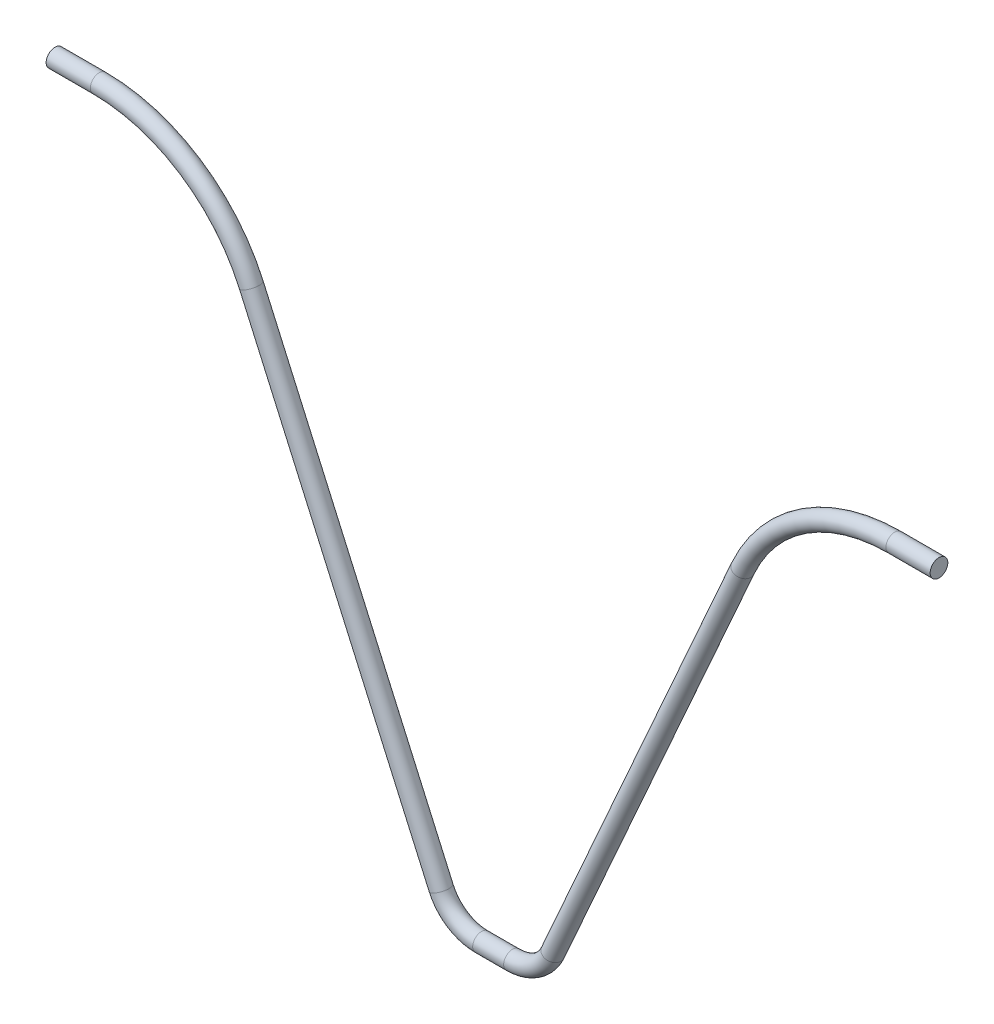
ISO-10303-21;
HEADER;
FILE_DESCRIPTION(('STEP AP214'),'2;1');
FILE_NAME('part.step','',(''),(''),'','','');
FILE_SCHEMA(('AUTOMOTIVE_DESIGN { 1 0 10303 214 1 1 1 1 }'));
ENDSEC;
DATA;
#1=APPLICATION_CONTEXT('core data for automotive mechanical design processes');
#2=APPLICATION_PROTOCOL_DEFINITION('international standard','automotive_design',2000,#1);
#3=PRODUCT_CONTEXT('',#1,'mechanical');
#4=PRODUCT('Part','Part','',(#3));
#5=PRODUCT_RELATED_PRODUCT_CATEGORY('part','',(#4));
#6=PRODUCT_DEFINITION_FORMATION('','',#4);
#7=PRODUCT_DEFINITION_CONTEXT('part definition',#1,'design');
#8=PRODUCT_DEFINITION('design','',#6,#7);
#9=PRODUCT_DEFINITION_SHAPE('','',#8);
#10=(LENGTH_UNIT() NAMED_UNIT(*) SI_UNIT(.MILLI.,.METRE.));
#11=(NAMED_UNIT(*) PLANE_ANGLE_UNIT() SI_UNIT($,.RADIAN.));
#12=(NAMED_UNIT(*) SI_UNIT($,.STERADIAN.) SOLID_ANGLE_UNIT());
#13=UNCERTAINTY_MEASURE_WITH_UNIT(LENGTH_MEASURE(1.E-05),#10,'distance_accuracy_value','');
#14=(GEOMETRIC_REPRESENTATION_CONTEXT(3) GLOBAL_UNCERTAINTY_ASSIGNED_CONTEXT((#13)) GLOBAL_UNIT_ASSIGNED_CONTEXT((#10,
#11,#12)) REPRESENTATION_CONTEXT('',''));
#15=CARTESIAN_POINT('',(0.,0.,0.));
#16=DIRECTION('',(0.,0.,1.));
#17=DIRECTION('',(1.,0.,0.));
#18=AXIS2_PLACEMENT_3D('',#15,#16,#17);
#19=CARTESIAN_POINT('',(1000.,840.,0.));
#20=DIRECTION('',(1.,0.,0.));
#21=DIRECTION('',(0.,0.,-1.));
#22=AXIS2_PLACEMENT_3D('',#19,#20,#21);
#23=PLANE('',#22);
#24=CARTESIAN_POINT('',(1000.,840.,0.));
#25=DIRECTION('',(1.,0.,0.));
#26=DIRECTION('',(0.,0.,-1.));
#27=AXIS2_PLACEMENT_3D('',#24,#25,#26);
#28=CIRCLE('',#27,20.);
#29=CARTESIAN_POINT('',(1000.,840.,-20.));
#30=VERTEX_POINT('',#29);
#31=EDGE_CURVE('E82',#30,#30,#28,.T.);
#32=ORIENTED_EDGE('',*,*,#31,.T.);
#33=EDGE_LOOP('',(#32));
#34=FACE_BOUND('',#33,.T.);
#35=ADVANCED_FACE('F39',(#34),#23,.T.);
#36=CARTESIAN_POINT('',(-1000.,840.,0.));
#37=DIRECTION('',(1.,0.,0.));
#38=DIRECTION('',(0.,0.,-1.));
#39=AXIS2_PLACEMENT_3D('',#36,#37,#38);
#40=PLANE('',#39);
#41=CARTESIAN_POINT('',(-1000.,840.,0.));
#42=DIRECTION('',(1.,0.,0.));
#43=DIRECTION('',(0.,0.,-1.));
#44=AXIS2_PLACEMENT_3D('',#41,#42,#43);
#45=CIRCLE('',#44,20.);
#46=CARTESIAN_POINT('',(-1000.,840.,-20.));
#47=VERTEX_POINT('',#46);
#48=EDGE_CURVE('E10',#47,#47,#45,.T.);
#49=ORIENTED_EDGE('',*,*,#48,.F.);
#50=EDGE_LOOP('',(#49));
#51=FACE_BOUND('',#50,.T.);
#52=ADVANCED_FACE('F91',(#51),#40,.F.);
#53=CARTESIAN_POINT('',(1000.,840.,0.));
#54=DIRECTION('',(-1.,0.,0.));
#55=DIRECTION('',(0.,0.,1.));
#56=AXIS2_PLACEMENT_3D('',#53,#54,#55);
#57=CYLINDRICAL_SURFACE('',#56,20.);
#58=CARTESIAN_POINT('',(900.,840.,0.));
#59=DIRECTION('',(1.,0.,0.));
#60=DIRECTION('',(0.,0.,-1.));
#61=AXIS2_PLACEMENT_3D('',#58,#59,#60);
#62=CIRCLE('',#61,20.);
#63=CARTESIAN_POINT('',(900.,859.999999999999,0.));
#64=VERTEX_POINT('',#63);
#65=EDGE_CURVE('E78',#64,#64,#62,.T.);
#66=ORIENTED_EDGE('',*,*,#65,.T.);
#67=EDGE_LOOP('',(#66));
#68=FACE_BOUND('',#67,.T.);
#69=ORIENTED_EDGE('',*,*,#31,.F.);
#70=EDGE_LOOP('',(#69));
#71=FACE_BOUND('',#70,.T.);
#72=ADVANCED_FACE('F88',(#68,#71),#57,.T.);
#73=CARTESIAN_POINT('',(900.,463.52071005917,0.));
#74=DIRECTION('',(0.,0.,1.));
#75=DIRECTION('',(1.,0.,0.));
#76=AXIS2_PLACEMENT_3D('',#73,#74,#75);
#77=TOROIDAL_SURFACE('',#76,376.479289940829,20.);
#78=CARTESIAN_POINT('',(555.941597945112,616.362038664322,0.));
#79=DIRECTION('',(0.405975395430579,0.913884007029877,0.));
#80=DIRECTION('',(0.,0.,-1.));
#81=AXIS2_PLACEMENT_3D('',#78,#79,#80);
#82=CIRCLE('',#81,20.);
#83=CARTESIAN_POINT('',(537.663917804514,624.481546572934,0.));
#84=VERTEX_POINT('',#83);
#85=EDGE_CURVE('E74',#84,#84,#82,.T.);
#86=CARTESIAN_POINT('',(900.,463.52071005917,0.));
#87=DIRECTION('',(0.,0.,1.));
#88=DIRECTION('',(1.,0.,0.));
#89=AXIS2_PLACEMENT_3D('',#86,#87,#88);
#90=CIRCLE('',#89,396.479289940829);
#91=EDGE_CURVE('',#64,#84,#90,.T.);
#92=ORIENTED_EDGE('',*,*,#65,.F.);
#93=ORIENTED_EDGE('',*,*,#85,.T.);
#94=ORIENTED_EDGE('',*,*,#91,.T.);
#95=ORIENTED_EDGE('',*,*,#91,.F.);
#96=EDGE_LOOP('',(#92,#94,#93,#95));
#97=FACE_BOUND('',#96,.T.);
#98=ADVANCED_FACE('F90',(#97),#77,.T.);
#99=CARTESIAN_POINT('',(555.941597945112,616.362038664322,0.));
#100=DIRECTION('',(-0.405975395430579,-0.913884007029877,0.));
#101=DIRECTION('',(0.913884007029877,-0.405975395430579,0.));
#102=AXIS2_PLACEMENT_3D('',#99,#100,#101);
#103=CYLINDRICAL_SURFACE('',#102,20.);
#104=CARTESIAN_POINT('',(126.388400702988,-350.597539543058,0.));
#105=DIRECTION('',(0.405975395430579,0.913884007029877,0.));
#106=DIRECTION('',(0.,0.,-1.));
#107=AXIS2_PLACEMENT_3D('',#104,#105,#106);
#108=CIRCLE('',#107,20.);
#109=CARTESIAN_POINT('',(144.666080843585,-358.71704745167,0.));
#110=VERTEX_POINT('',#109);
#111=EDGE_CURVE('E70',#110,#110,#108,.T.);
#112=ORIENTED_EDGE('',*,*,#111,.T.);
#113=EDGE_LOOP('',(#112));
#114=FACE_BOUND('',#113,.T.);
#115=ORIENTED_EDGE('',*,*,#85,.F.);
#116=EDGE_LOOP('',(#115));
#117=FACE_BOUND('',#116,.T.);
#118=ADVANCED_FACE('F98',(#114,#117),#103,.T.);
#119=CARTESIAN_POINT('',(35.,-310.,0.));
#120=DIRECTION('',(0.,0.,-1.));
#121=DIRECTION('',(-1.,0.,0.));
#122=AXIS2_PLACEMENT_3D('',#119,#120,#121);
#123=TOROIDAL_SURFACE('',#122,100.,20.);
#124=CARTESIAN_POINT('',(34.9999999999999,-410.,0.));
#125=DIRECTION('',(1.,0.,0.));
#126=DIRECTION('',(0.,0.,-1.));
#127=AXIS2_PLACEMENT_3D('',#124,#125,#126);
#128=CIRCLE('',#127,20.);
#129=CARTESIAN_POINT('',(34.9999999999999,-430.,0.));
#130=VERTEX_POINT('',#129);
#131=EDGE_CURVE('E66',#130,#130,#128,.T.);
#132=CARTESIAN_POINT('',(35.,-310.,0.));
#133=DIRECTION('',(0.,0.,-1.));
#134=DIRECTION('',(-1.,0.,0.));
#135=AXIS2_PLACEMENT_3D('',#132,#133,#134);
#136=CIRCLE('',#135,120.);
#137=EDGE_CURVE('',#110,#130,#136,.T.);
#138=ORIENTED_EDGE('',*,*,#111,.F.);
#139=ORIENTED_EDGE('',*,*,#131,.T.);
#140=ORIENTED_EDGE('',*,*,#137,.T.);
#141=ORIENTED_EDGE('',*,*,#137,.F.);
#142=EDGE_LOOP('',(#138,#140,#139,#141));
#143=FACE_BOUND('',#142,.T.);
#144=ADVANCED_FACE('F123',(#143),#123,.T.);
#145=CARTESIAN_POINT('',(34.9999999999999,-410.,0.));
#146=DIRECTION('',(-1.,0.,0.));
#147=DIRECTION('',(0.,0.,1.));
#148=AXIS2_PLACEMENT_3D('',#145,#146,#147);
#149=CYLINDRICAL_SURFACE('',#148,20.);
#150=CARTESIAN_POINT('',(-35.,-410.,0.));
#151=DIRECTION('',(1.,0.,0.));
#152=DIRECTION('',(0.,0.,-1.));
#153=AXIS2_PLACEMENT_3D('',#150,#151,#152);
#154=CIRCLE('',#153,20.);
#155=CARTESIAN_POINT('',(-35.,-430.,0.));
#156=VERTEX_POINT('',#155);
#157=EDGE_CURVE('E62',#156,#156,#154,.T.);
#158=ORIENTED_EDGE('',*,*,#157,.T.);
#159=EDGE_LOOP('',(#158));
#160=FACE_BOUND('',#159,.T.);
#161=ORIENTED_EDGE('',*,*,#131,.F.);
#162=EDGE_LOOP('',(#161));
#163=FACE_BOUND('',#162,.T.);
#164=ADVANCED_FACE('F119',(#160,#163),#149,.T.);
#165=CARTESIAN_POINT('',(-35.,-310.,0.));
#166=DIRECTION('',(0.,0.,-1.));
#167=DIRECTION('',(-1.,0.,0.));
#168=AXIS2_PLACEMENT_3D('',#165,#166,#167);
#169=TOROIDAL_SURFACE('',#168,99.9999999999999,20.);
#170=CARTESIAN_POINT('',(-126.388400702988,-350.597539543058,0.));
#171=DIRECTION('',(0.405975395430581,-0.913884007029877,0.));
#172=DIRECTION('',(0.,0.,-1.));
#173=AXIS2_PLACEMENT_3D('',#170,#171,#172);
#174=CIRCLE('',#173,20.);
#175=CARTESIAN_POINT('',(-144.666080843585,-358.71704745167,0.));
#176=VERTEX_POINT('',#175);
#177=EDGE_CURVE('E56',#176,#176,#174,.T.);
#178=CARTESIAN_POINT('',(-35.,-310.,0.));
#179=DIRECTION('',(0.,0.,-1.));
#180=DIRECTION('',(-1.,0.,0.));
#181=AXIS2_PLACEMENT_3D('',#178,#179,#180);
#182=CIRCLE('',#181,120.);
#183=EDGE_CURVE('',#156,#176,#182,.T.);
#184=ORIENTED_EDGE('',*,*,#157,.F.);
#185=ORIENTED_EDGE('',*,*,#177,.T.);
#186=ORIENTED_EDGE('',*,*,#183,.T.);
#187=ORIENTED_EDGE('',*,*,#183,.F.);
#188=EDGE_LOOP('',(#184,#186,#185,#187));
#189=FACE_BOUND('',#188,.T.);
#190=ADVANCED_FACE('F115',(#189),#169,.T.);
#191=CARTESIAN_POINT('',(-126.388400702988,-350.597539543058,0.));
#192=DIRECTION('',(-0.405975395430579,0.913884007029877,0.));
#193=DIRECTION('',(-0.913884007029877,-0.405975395430579,0.));
#194=AXIS2_PLACEMENT_3D('',#191,#192,#193);
#195=CYLINDRICAL_SURFACE('',#194,20.);
#196=CARTESIAN_POINT('',(-555.941597945112,616.362038664322,0.));
#197=DIRECTION('',(0.405975395430579,-0.913884007029877,0.));
#198=DIRECTION('',(0.,0.,-1.));
#199=AXIS2_PLACEMENT_3D('',#196,#197,#198);
#200=CIRCLE('',#199,20.);
#201=CARTESIAN_POINT('',(-537.663917804514,624.481546572934,0.));
#202=VERTEX_POINT('',#201);
#203=EDGE_CURVE('E51',#202,#202,#200,.T.);
#204=ORIENTED_EDGE('',*,*,#203,.T.);
#205=EDGE_LOOP('',(#204));
#206=FACE_BOUND('',#205,.T.);
#207=ORIENTED_EDGE('',*,*,#177,.F.);
#208=EDGE_LOOP('',(#207));
#209=FACE_BOUND('',#208,.T.);
#210=ADVANCED_FACE('F109',(#206,#209),#195,.T.);
#211=CARTESIAN_POINT('',(-900.,463.52071005917,0.));
#212=DIRECTION('',(0.,0.,1.));
#213=DIRECTION('',(1.,0.,0.));
#214=AXIS2_PLACEMENT_3D('',#211,#212,#213);
#215=TOROIDAL_SURFACE('',#214,376.47928994083,20.);
#216=CARTESIAN_POINT('',(-900.,840.,0.));
#217=DIRECTION('',(1.,0.,0.));
#218=DIRECTION('',(0.,0.,-1.));
#219=AXIS2_PLACEMENT_3D('',#216,#217,#218);
#220=CIRCLE('',#219,20.);
#221=CARTESIAN_POINT('',(-900.,860.,0.));
#222=VERTEX_POINT('',#221);
#223=EDGE_CURVE('E46',#222,#222,#220,.T.);
#224=CARTESIAN_POINT('',(-900.,463.52071005917,0.));
#225=DIRECTION('',(0.,0.,1.));
#226=DIRECTION('',(1.,0.,0.));
#227=AXIS2_PLACEMENT_3D('',#224,#225,#226);
#228=CIRCLE('',#227,396.47928994083);
#229=EDGE_CURVE('',#202,#222,#228,.T.);
#230=ORIENTED_EDGE('',*,*,#203,.F.);
#231=ORIENTED_EDGE('',*,*,#223,.T.);
#232=ORIENTED_EDGE('',*,*,#229,.T.);
#233=ORIENTED_EDGE('',*,*,#229,.F.);
#234=EDGE_LOOP('',(#230,#232,#231,#233));
#235=FACE_BOUND('',#234,.T.);
#236=ADVANCED_FACE('F104',(#235),#215,.T.);
#237=CARTESIAN_POINT('',(-900.,840.,0.));
#238=DIRECTION('',(-1.,0.,0.));
#239=DIRECTION('',(0.,0.,1.));
#240=AXIS2_PLACEMENT_3D('',#237,#238,#239);
#241=CYLINDRICAL_SURFACE('',#240,20.);
#242=ORIENTED_EDGE('',*,*,#48,.T.);
#243=EDGE_LOOP('',(#242));
#244=FACE_BOUND('',#243,.T.);
#245=ORIENTED_EDGE('',*,*,#223,.F.);
#246=EDGE_LOOP('',(#245));
#247=FACE_BOUND('',#246,.T.);
#248=ADVANCED_FACE('F102',(#244,#247),#241,.T.);
#249=CLOSED_SHELL('',(#35,#52,#72,#98,#118,#144,#164,#190,#210,#236,#248));
#250=MANIFOLD_SOLID_BREP('B2',#249);
#251=ADVANCED_BREP_SHAPE_REPRESENTATION('',(#18,#250),#14);
#252=SHAPE_DEFINITION_REPRESENTATION(#9,#251);
ENDSEC;
END-ISO-10303-21;
